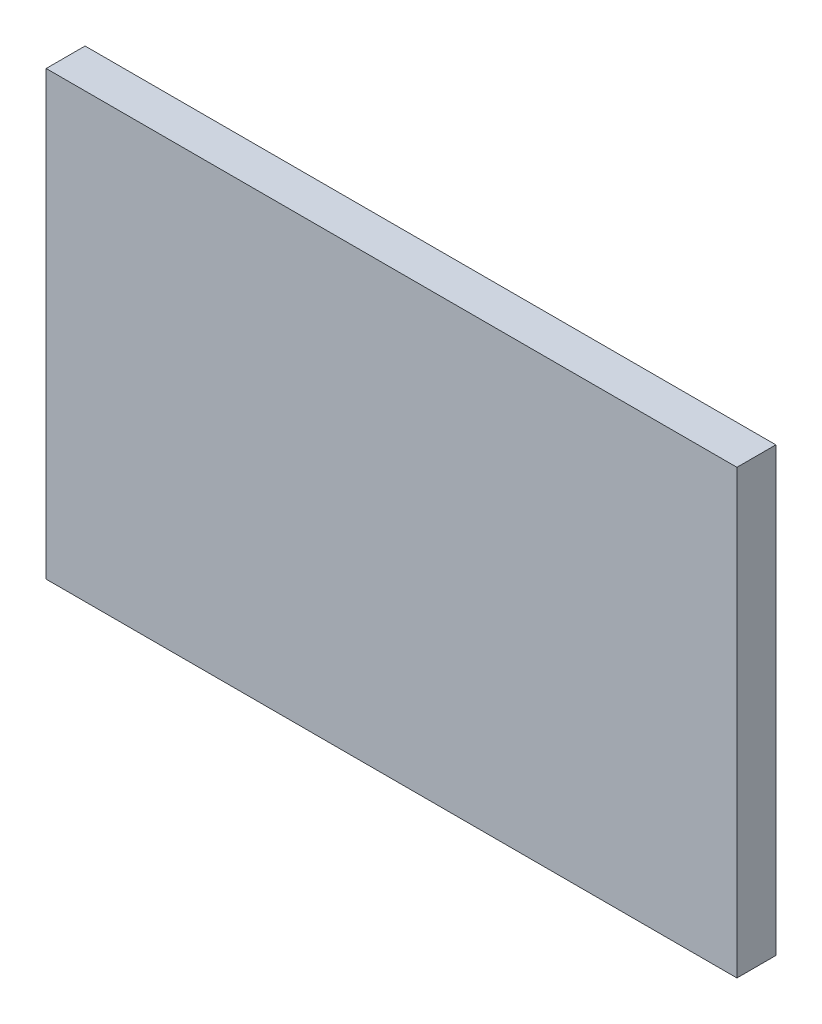
ISO-10303-21;
HEADER;
FILE_DESCRIPTION(('STEP AP214'),'2;1');
FILE_NAME('part.step','',(''),(''),'','','');
FILE_SCHEMA(('AUTOMOTIVE_DESIGN { 1 0 10303 214 1 1 1 1 }'));
ENDSEC;
DATA;
#1=APPLICATION_CONTEXT('core data for automotive mechanical design processes');
#2=APPLICATION_PROTOCOL_DEFINITION('international standard','automotive_design',2000,#1);
#3=PRODUCT_CONTEXT('',#1,'mechanical');
#4=PRODUCT('Part','Part','',(#3));
#5=PRODUCT_RELATED_PRODUCT_CATEGORY('part','',(#4));
#6=PRODUCT_DEFINITION_FORMATION('','',#4);
#7=PRODUCT_DEFINITION_CONTEXT('part definition',#1,'design');
#8=PRODUCT_DEFINITION('design','',#6,#7);
#9=PRODUCT_DEFINITION_SHAPE('','',#8);
#10=(LENGTH_UNIT() NAMED_UNIT(*) SI_UNIT(.MILLI.,.METRE.));
#11=(NAMED_UNIT(*) PLANE_ANGLE_UNIT() SI_UNIT($,.RADIAN.));
#12=(NAMED_UNIT(*) SI_UNIT($,.STERADIAN.) SOLID_ANGLE_UNIT());
#13=UNCERTAINTY_MEASURE_WITH_UNIT(LENGTH_MEASURE(1.E-05),#10,'distance_accuracy_value','');
#14=(GEOMETRIC_REPRESENTATION_CONTEXT(3) GLOBAL_UNCERTAINTY_ASSIGNED_CONTEXT((#13)) GLOBAL_UNIT_ASSIGNED_CONTEXT((#10,
#11,#12)) REPRESENTATION_CONTEXT('',''));
#15=CARTESIAN_POINT('',(0.,0.,0.));
#16=DIRECTION('',(0.,0.,1.));
#17=DIRECTION('',(1.,0.,0.));
#18=AXIS2_PLACEMENT_3D('',#15,#16,#17);
#19=CARTESIAN_POINT('',(49.5883079995744,-31.75,5.588));
#20=DIRECTION('',(-1.,0.,0.));
#21=DIRECTION('',(0.,0.,1.));
#22=AXIS2_PLACEMENT_3D('',#19,#20,#21);
#23=PLANE('',#22);
#24=DIRECTION('',(0.,1.,0.));
#25=VECTOR('',#24,1.);
#26=CARTESIAN_POINT('',(49.5883079995744,-31.75,0.));
#27=LINE('',#26,#25);
#28=CARTESIAN_POINT('',(49.5883079995744,-31.75,0.));
#29=VERTEX_POINT('',#28);
#30=CARTESIAN_POINT('',(49.5883079995744,31.75,0.));
#31=VERTEX_POINT('',#30);
#32=EDGE_CURVE('E95',#29,#31,#27,.T.);
#33=ORIENTED_EDGE('',*,*,#32,.T.);
#34=DIRECTION('',(0.,0.,-1.));
#35=VECTOR('',#34,1.);
#36=CARTESIAN_POINT('',(49.5883079995744,31.75,5.588));
#37=LINE('',#36,#35);
#38=CARTESIAN_POINT('',(49.5883079995744,31.75,5.588));
#39=VERTEX_POINT('',#38);
#40=EDGE_CURVE('E11',#39,#31,#37,.T.);
#41=ORIENTED_EDGE('',*,*,#40,.F.);
#42=DIRECTION('',(0.,1.,0.));
#43=VECTOR('',#42,1.);
#44=CARTESIAN_POINT('',(49.5883079995744,-31.75,5.588));
#45=LINE('',#44,#43);
#46=CARTESIAN_POINT('',(49.5883079995744,-31.75,5.588));
#47=VERTEX_POINT('',#46);
#48=EDGE_CURVE('E83',#47,#39,#45,.T.);
#49=ORIENTED_EDGE('',*,*,#48,.F.);
#50=DIRECTION('',(0.,0.,-1.));
#51=VECTOR('',#50,1.);
#52=CARTESIAN_POINT('',(49.5883079995744,-31.75,5.588));
#53=LINE('',#52,#51);
#54=EDGE_CURVE('E91',#47,#29,#53,.T.);
#55=ORIENTED_EDGE('',*,*,#54,.T.);
#56=EDGE_LOOP('',(#33,#41,#49,#55));
#57=FACE_BOUND('',#56,.T.);
#58=ADVANCED_FACE('F32',(#57),#23,.F.);
#59=CARTESIAN_POINT('',(-49.5883079995744,31.75,5.588));
#60=DIRECTION('',(0.,-1.,0.));
#61=DIRECTION('',(0.,0.,-1.));
#62=AXIS2_PLACEMENT_3D('',#59,#60,#61);
#63=PLANE('',#62);
#64=DIRECTION('',(-1.,0.,0.));
#65=VECTOR('',#64,1.);
#66=CARTESIAN_POINT('',(-49.5883079995744,31.75,0.));
#67=LINE('',#66,#65);
#68=CARTESIAN_POINT('',(-49.5883079995744,31.75,0.));
#69=VERTEX_POINT('',#68);
#70=EDGE_CURVE('E87',#31,#69,#67,.T.);
#71=ORIENTED_EDGE('',*,*,#70,.T.);
#72=DIRECTION('',(0.,0.,-1.));
#73=VECTOR('',#72,1.);
#74=CARTESIAN_POINT('',(-49.5883079995744,31.75,5.588));
#75=LINE('',#74,#73);
#76=CARTESIAN_POINT('',(-49.5883079995744,31.75,5.588));
#77=VERTEX_POINT('',#76);
#78=EDGE_CURVE('E40',#77,#69,#75,.T.);
#79=ORIENTED_EDGE('',*,*,#78,.F.);
#80=DIRECTION('',(-1.,0.,0.));
#81=VECTOR('',#80,1.);
#82=CARTESIAN_POINT('',(-49.5883079995744,31.75,5.588));
#83=LINE('',#82,#81);
#84=EDGE_CURVE('E78',#39,#77,#83,.T.);
#85=ORIENTED_EDGE('',*,*,#84,.F.);
#86=ORIENTED_EDGE('',*,*,#40,.T.);
#87=EDGE_LOOP('',(#71,#79,#85,#86));
#88=FACE_BOUND('',#87,.T.);
#89=ADVANCED_FACE('F86',(#88),#63,.F.);
#90=CARTESIAN_POINT('',(-49.5883079995744,-31.75,5.588));
#91=DIRECTION('',(1.,0.,0.));
#92=DIRECTION('',(0.,0.,-1.));
#93=AXIS2_PLACEMENT_3D('',#90,#91,#92);
#94=PLANE('',#93);
#95=DIRECTION('',(0.,-1.,0.));
#96=VECTOR('',#95,1.);
#97=CARTESIAN_POINT('',(-49.5883079995744,-31.75,0.));
#98=LINE('',#97,#96);
#99=CARTESIAN_POINT('',(-49.5883079995744,-31.75,0.));
#100=VERTEX_POINT('',#99);
#101=EDGE_CURVE('E65',#69,#100,#98,.T.);
#102=ORIENTED_EDGE('',*,*,#101,.T.);
#103=DIRECTION('',(0.,0.,-1.));
#104=VECTOR('',#103,1.);
#105=CARTESIAN_POINT('',(-49.5883079995744,-31.75,5.588));
#106=LINE('',#105,#104);
#107=CARTESIAN_POINT('',(-49.5883079995744,-31.75,5.588));
#108=VERTEX_POINT('',#107);
#109=EDGE_CURVE('E88',#108,#100,#106,.T.);
#110=ORIENTED_EDGE('',*,*,#109,.F.);
#111=DIRECTION('',(0.,-1.,0.));
#112=VECTOR('',#111,1.);
#113=CARTESIAN_POINT('',(-49.5883079995744,-31.75,5.588));
#114=LINE('',#113,#112);
#115=EDGE_CURVE('E81',#77,#108,#114,.T.);
#116=ORIENTED_EDGE('',*,*,#115,.F.);
#117=ORIENTED_EDGE('',*,*,#78,.T.);
#118=EDGE_LOOP('',(#102,#110,#116,#117));
#119=FACE_BOUND('',#118,.T.);
#120=ADVANCED_FACE('F89',(#119),#94,.F.);
#121=CARTESIAN_POINT('',(-49.5883079995744,-31.75,5.588));
#122=DIRECTION('',(0.,1.,0.));
#123=DIRECTION('',(0.,0.,1.));
#124=AXIS2_PLACEMENT_3D('',#121,#122,#123);
#125=PLANE('',#124);
#126=DIRECTION('',(1.,0.,0.));
#127=VECTOR('',#126,1.);
#128=CARTESIAN_POINT('',(-49.5883079995744,-31.75,0.));
#129=LINE('',#128,#127);
#130=EDGE_CURVE('E71',#100,#29,#129,.T.);
#131=ORIENTED_EDGE('',*,*,#130,.T.);
#132=ORIENTED_EDGE('',*,*,#54,.F.);
#133=DIRECTION('',(1.,0.,0.));
#134=VECTOR('',#133,1.);
#135=CARTESIAN_POINT('',(-49.5883079995744,-31.75,5.588));
#136=LINE('',#135,#134);
#137=EDGE_CURVE('E48',#108,#47,#136,.T.);
#138=ORIENTED_EDGE('',*,*,#137,.F.);
#139=ORIENTED_EDGE('',*,*,#109,.T.);
#140=EDGE_LOOP('',(#131,#132,#138,#139));
#141=FACE_BOUND('',#140,.T.);
#142=ADVANCED_FACE('F102',(#141),#125,.F.);
#143=CARTESIAN_POINT('',(0.,0.,5.588));
#144=DIRECTION('',(0.,0.,-1.));
#145=DIRECTION('',(-1.,0.,0.));
#146=AXIS2_PLACEMENT_3D('',#143,#144,#145);
#147=PLANE('',#146);
#148=ORIENTED_EDGE('',*,*,#48,.T.);
#149=ORIENTED_EDGE('',*,*,#84,.T.);
#150=ORIENTED_EDGE('',*,*,#115,.T.);
#151=ORIENTED_EDGE('',*,*,#137,.T.);
#152=EDGE_LOOP('',(#148,#149,#150,#151));
#153=FACE_BOUND('',#152,.T.);
#154=ADVANCED_FACE('F79',(#153),#147,.F.);
#155=CARTESIAN_POINT('',(0.,0.,0.));
#156=DIRECTION('',(0.,0.,-1.));
#157=DIRECTION('',(-1.,0.,0.));
#158=AXIS2_PLACEMENT_3D('',#155,#156,#157);
#159=PLANE('',#158);
#160=ORIENTED_EDGE('',*,*,#32,.F.);
#161=ORIENTED_EDGE('',*,*,#130,.F.);
#162=ORIENTED_EDGE('',*,*,#101,.F.);
#163=ORIENTED_EDGE('',*,*,#70,.F.);
#164=EDGE_LOOP('',(#160,#161,#162,#163));
#165=FACE_BOUND('',#164,.T.);
#166=ADVANCED_FACE('F105',(#165),#159,.T.);
#167=CLOSED_SHELL('',(#58,#89,#120,#142,#154,#166));
#168=MANIFOLD_SOLID_BREP('B2',#167);
#169=ADVANCED_BREP_SHAPE_REPRESENTATION('',(#18,#168),#14);
#170=SHAPE_DEFINITION_REPRESENTATION(#9,#169);
ENDSEC;
END-ISO-10303-21;
